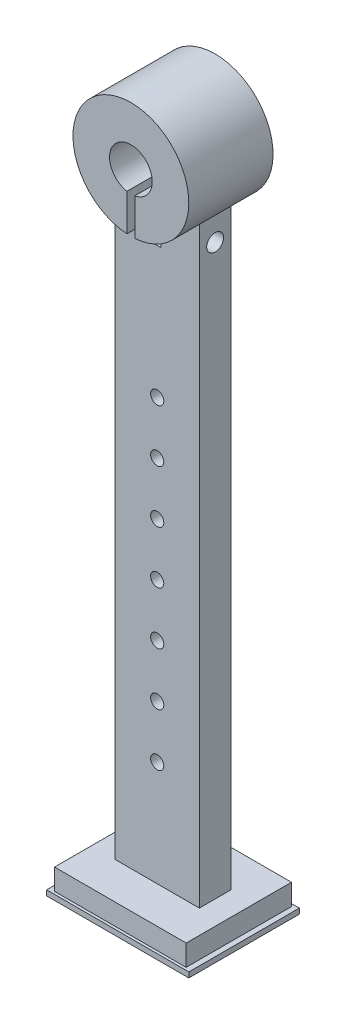
ISO-10303-21;
HEADER;
FILE_DESCRIPTION(('STEP AP214'),'2;1');
FILE_NAME('part.step','',(''),(''),'','','');
FILE_SCHEMA(('AUTOMOTIVE_DESIGN { 1 0 10303 214 1 1 1 1 }'));
ENDSEC;
DATA;
#1=APPLICATION_CONTEXT('core data for automotive mechanical design processes');
#2=APPLICATION_PROTOCOL_DEFINITION('international standard','automotive_design',2000,#1);
#3=PRODUCT_CONTEXT('',#1,'mechanical');
#4=PRODUCT('Part','Part','',(#3));
#5=PRODUCT_RELATED_PRODUCT_CATEGORY('part','',(#4));
#6=PRODUCT_DEFINITION_FORMATION('','',#4);
#7=PRODUCT_DEFINITION_CONTEXT('part definition',#1,'design');
#8=PRODUCT_DEFINITION('design','',#6,#7);
#9=PRODUCT_DEFINITION_SHAPE('','',#8);
#10=(LENGTH_UNIT() NAMED_UNIT(*) SI_UNIT(.MILLI.,.METRE.));
#11=(NAMED_UNIT(*) PLANE_ANGLE_UNIT() SI_UNIT($,.RADIAN.));
#12=(NAMED_UNIT(*) SI_UNIT($,.STERADIAN.) SOLID_ANGLE_UNIT());
#13=UNCERTAINTY_MEASURE_WITH_UNIT(LENGTH_MEASURE(1.E-05),#10,'distance_accuracy_value','');
#14=(GEOMETRIC_REPRESENTATION_CONTEXT(3) GLOBAL_UNCERTAINTY_ASSIGNED_CONTEXT((#13)) GLOBAL_UNIT_ASSIGNED_CONTEXT((#10,
#11,#12)) REPRESENTATION_CONTEXT('',''));
#15=CARTESIAN_POINT('',(0.,0.,0.));
#16=DIRECTION('',(0.,0.,1.));
#17=DIRECTION('',(1.,0.,0.));
#18=AXIS2_PLACEMENT_3D('',#15,#16,#17);
#19=CARTESIAN_POINT('',(0.,0.,8.));
#20=DIRECTION('',(0.,0.,-1.));
#21=DIRECTION('',(-1.,0.,0.));
#22=AXIS2_PLACEMENT_3D('',#19,#20,#21);
#23=CYLINDRICAL_SURFACE('',#22,4.05);
#24=DIRECTION('',(0.,0.,-1.));
#25=VECTOR('',#24,1.);
#26=CARTESIAN_POINT('',(0.75,-3.97994974842648,8.));
#27=LINE('',#26,#25);
#28=CARTESIAN_POINT('',(0.75,-3.97994974842648,8.));
#29=VERTEX_POINT('',#28);
#30=CARTESIAN_POINT('',(0.75,-3.97994974842648,-8.));
#31=VERTEX_POINT('',#30);
#32=EDGE_CURVE('E452',#29,#31,#27,.T.);
#33=ORIENTED_EDGE('',*,*,#32,.F.);
#34=CARTESIAN_POINT('',(0.,0.,8.));
#35=DIRECTION('',(0.,0.,1.));
#36=DIRECTION('',(1.,0.,0.));
#37=AXIS2_PLACEMENT_3D('',#34,#35,#36);
#38=CIRCLE('',#37,4.05);
#39=CARTESIAN_POINT('',(-0.75,-3.97994974842648,8.));
#40=VERTEX_POINT('',#39);
#41=EDGE_CURVE('E504',#29,#40,#38,.T.);
#42=ORIENTED_EDGE('',*,*,#41,.T.);
#43=DIRECTION('',(0.,0.,-1.));
#44=VECTOR('',#43,1.);
#45=CARTESIAN_POINT('',(-0.75,-3.97994974842648,8.));
#46=LINE('',#45,#44);
#47=CARTESIAN_POINT('',(-0.75,-3.97994974842648,-8.));
#48=VERTEX_POINT('',#47);
#49=EDGE_CURVE('E438',#48,#40,#46,.F.);
#50=ORIENTED_EDGE('',*,*,#49,.F.);
#51=CARTESIAN_POINT('',(0.,0.,-8.));
#52=DIRECTION('',(0.,0.,1.));
#53=DIRECTION('',(1.,0.,0.));
#54=AXIS2_PLACEMENT_3D('',#51,#52,#53);
#55=CIRCLE('',#54,4.05);
#56=EDGE_CURVE('E503',#31,#48,#55,.T.);
#57=ORIENTED_EDGE('',*,*,#56,.F.);
#58=EDGE_LOOP('',(#33,#42,#50,#57));
#59=FACE_BOUND('',#58,.T.);
#60=ADVANCED_FACE('F43',(#59),#23,.F.);
#61=CARTESIAN_POINT('',(0.,0.,8.));
#62=DIRECTION('',(0.,0.,-1.));
#63=DIRECTION('',(-1.,0.,0.));
#64=AXIS2_PLACEMENT_3D('',#61,#62,#63);
#65=CYLINDRICAL_SURFACE('',#64,11.);
#66=CARTESIAN_POINT('',(0.,0.,8.));
#67=DIRECTION('',(0.,0.,1.));
#68=DIRECTION('',(1.,0.,0.));
#69=AXIS2_PLACEMENT_3D('',#66,#67,#68);
#70=CIRCLE('',#69,11.);
#71=CARTESIAN_POINT('',(0.750000000000001,-10.974402033824,8.));
#72=VERTEX_POINT('',#71);
#73=CARTESIAN_POINT('',(-0.749999999999999,-10.974402033824,8.));
#74=VERTEX_POINT('',#73);
#75=EDGE_CURVE('E508',#72,#74,#70,.T.);
#76=ORIENTED_EDGE('',*,*,#75,.F.);
#77=DIRECTION('',(0.,0.,-1.));
#78=VECTOR('',#77,1.);
#79=CARTESIAN_POINT('',(0.750000000000001,-10.974402033824,8.));
#80=LINE('',#79,#78);
#81=CARTESIAN_POINT('',(0.750000000000001,-10.974402033824,3.));
#82=VERTEX_POINT('',#81);
#83=EDGE_CURVE('E449',#72,#82,#80,.T.);
#84=ORIENTED_EDGE('',*,*,#83,.T.);
#85=CARTESIAN_POINT('',(0.,0.,3.));
#86=DIRECTION('',(0.,0.,1.));
#87=DIRECTION('',(1.,0.,0.));
#88=AXIS2_PLACEMENT_3D('',#85,#86,#87);
#89=CIRCLE('',#88,11.);
#90=CARTESIAN_POINT('',(8.,-7.54983443527075,3.));
#91=VERTEX_POINT('',#90);
#92=EDGE_CURVE('E461',#82,#91,#89,.T.);
#93=ORIENTED_EDGE('',*,*,#92,.T.);
#94=DIRECTION('',(0.,0.,-1.));
#95=VECTOR('',#94,1.);
#96=CARTESIAN_POINT('',(8.,-7.54983443527075,3.));
#97=LINE('',#96,#95);
#98=CARTESIAN_POINT('',(8.,-7.54983443527075,-3.));
#99=VERTEX_POINT('',#98);
#100=EDGE_CURVE('E472',#91,#99,#97,.T.);
#101=ORIENTED_EDGE('',*,*,#100,.T.);
#102=CARTESIAN_POINT('',(0.,0.,-3.));
#103=DIRECTION('',(0.,0.,1.));
#104=DIRECTION('',(1.,0.,0.));
#105=AXIS2_PLACEMENT_3D('',#102,#103,#104);
#106=CIRCLE('',#105,11.);
#107=CARTESIAN_POINT('',(0.750000000000001,-10.974402033824,-3.));
#108=VERTEX_POINT('',#107);
#109=EDGE_CURVE('E455',#108,#99,#106,.T.);
#110=ORIENTED_EDGE('',*,*,#109,.F.);
#111=CARTESIAN_POINT('',(0.750000000000001,-10.974402033824,-8.));
#112=VERTEX_POINT('',#111);
#113=EDGE_CURVE('E444',#108,#112,#80,.T.);
#114=ORIENTED_EDGE('',*,*,#113,.T.);
#115=CARTESIAN_POINT('',(0.,0.,-8.));
#116=DIRECTION('',(0.,0.,1.));
#117=DIRECTION('',(1.,0.,0.));
#118=AXIS2_PLACEMENT_3D('',#115,#116,#117);
#119=CIRCLE('',#118,11.);
#120=CARTESIAN_POINT('',(-0.749999999999999,-10.974402033824,-8.));
#121=VERTEX_POINT('',#120);
#122=EDGE_CURVE('E509',#112,#121,#119,.T.);
#123=ORIENTED_EDGE('',*,*,#122,.T.);
#124=DIRECTION('',(0.,0.,-1.));
#125=VECTOR('',#124,1.);
#126=CARTESIAN_POINT('',(-0.749999999999999,-10.974402033824,8.));
#127=LINE('',#126,#125);
#128=CARTESIAN_POINT('',(-0.749999999999999,-10.974402033824,-3.));
#129=VERTEX_POINT('',#128);
#130=EDGE_CURVE('E428',#121,#129,#127,.F.);
#131=ORIENTED_EDGE('',*,*,#130,.T.);
#132=CARTESIAN_POINT('',(-8.,-7.54983443527075,-3.));
#133=VERTEX_POINT('',#132);
#134=EDGE_CURVE('E473',#133,#129,#106,.T.);
#135=ORIENTED_EDGE('',*,*,#134,.F.);
#136=DIRECTION('',(0.,0.,-1.));
#137=VECTOR('',#136,1.);
#138=CARTESIAN_POINT('',(-8.,-7.54983443527075,3.));
#139=LINE('',#138,#137);
#140=CARTESIAN_POINT('',(-8.,-7.54983443527075,3.));
#141=VERTEX_POINT('',#140);
#142=EDGE_CURVE('E499',#141,#133,#139,.T.);
#143=ORIENTED_EDGE('',*,*,#142,.F.);
#144=CARTESIAN_POINT('',(-0.749999999999999,-10.974402033824,3.));
#145=VERTEX_POINT('',#144);
#146=EDGE_CURVE('E456',#141,#145,#89,.T.);
#147=ORIENTED_EDGE('',*,*,#146,.T.);
#148=EDGE_CURVE('E435',#145,#74,#127,.F.);
#149=ORIENTED_EDGE('',*,*,#148,.T.);
#150=EDGE_LOOP('',(#76,#84,#93,#101,#110,#114,#123,#131,#135,#143,#147,#149));
#151=FACE_BOUND('',#150,.T.);
#152=ADVANCED_FACE('F547',(#151),#65,.T.);
#153=CARTESIAN_POINT('',(0.,0.,8.));
#154=DIRECTION('',(0.,0.,1.));
#155=DIRECTION('',(1.,0.,0.));
#156=AXIS2_PLACEMENT_3D('',#153,#154,#155);
#157=PLANE('',#156);
#158=DIRECTION('',(0.,1.,0.));
#159=VECTOR('',#158,1.);
#160=CARTESIAN_POINT('',(0.749999999999999,-3.,8.));
#161=LINE('',#160,#159);
#162=EDGE_CURVE('E410',#72,#29,#161,.T.);
#163=ORIENTED_EDGE('',*,*,#162,.F.);
#164=ORIENTED_EDGE('',*,*,#75,.T.);
#165=DIRECTION('',(0.,-1.,0.));
#166=VECTOR('',#165,1.);
#167=CARTESIAN_POINT('',(-0.750000000000001,-3.,8.));
#168=LINE('',#167,#166);
#169=EDGE_CURVE('E413',#40,#74,#168,.T.);
#170=ORIENTED_EDGE('',*,*,#169,.F.);
#171=ORIENTED_EDGE('',*,*,#41,.F.);
#172=EDGE_LOOP('',(#163,#164,#170,#171));
#173=FACE_BOUND('',#172,.T.);
#174=ADVANCED_FACE('F552',(#173),#157,.T.);
#175=CARTESIAN_POINT('',(0.,0.,-8.));
#176=DIRECTION('',(0.,0.,1.));
#177=DIRECTION('',(1.,0.,0.));
#178=AXIS2_PLACEMENT_3D('',#175,#176,#177);
#179=PLANE('',#178);
#180=ORIENTED_EDGE('',*,*,#122,.F.);
#181=DIRECTION('',(0.,1.,0.));
#182=VECTOR('',#181,1.);
#183=CARTESIAN_POINT('',(0.749999999999999,-3.,-8.));
#184=LINE('',#183,#182);
#185=EDGE_CURVE('E416',#112,#31,#184,.T.);
#186=ORIENTED_EDGE('',*,*,#185,.T.);
#187=ORIENTED_EDGE('',*,*,#56,.T.);
#188=DIRECTION('',(0.,-1.,0.));
#189=VECTOR('',#188,1.);
#190=CARTESIAN_POINT('',(-0.750000000000001,-3.,-8.));
#191=LINE('',#190,#189);
#192=EDGE_CURVE('E420',#48,#121,#191,.T.);
#193=ORIENTED_EDGE('',*,*,#192,.T.);
#194=EDGE_LOOP('',(#180,#186,#187,#193));
#195=FACE_BOUND('',#194,.T.);
#196=ADVANCED_FACE('F597',(#195),#179,.F.);
#197=CARTESIAN_POINT('',(-8.,0.,3.));
#198=DIRECTION('',(-1.,0.,0.));
#199=DIRECTION('',(0.,0.,1.));
#200=AXIS2_PLACEMENT_3D('',#197,#198,#199);
#201=PLANE('',#200);
#202=CARTESIAN_POINT('',(-8.,-12.,0.));
#203=DIRECTION('',(-1.,0.,0.));
#204=DIRECTION('',(0.,0.,1.));
#205=AXIS2_PLACEMENT_3D('',#202,#203,#204);
#206=CIRCLE('',#205,1.6);
#207=CARTESIAN_POINT('',(-8.,-12.,1.6));
#208=VERTEX_POINT('',#207);
#209=EDGE_CURVE('E406',#208,#208,#206,.T.);
#210=ORIENTED_EDGE('',*,*,#209,.F.);
#211=EDGE_LOOP('',(#210));
#212=FACE_BOUND('',#211,.T.);
#213=DIRECTION('',(0.,1.,0.));
#214=VECTOR('',#213,1.);
#215=CARTESIAN_POINT('',(-8.,0.,-3.));
#216=LINE('',#215,#214);
#217=CARTESIAN_POINT('',(-8.,-120.,-3.));
#218=VERTEX_POINT('',#217);
#219=EDGE_CURVE('E477',#218,#133,#216,.T.);
#220=ORIENTED_EDGE('',*,*,#219,.F.);
#221=DIRECTION('',(0.,0.,-1.));
#222=VECTOR('',#221,1.);
#223=CARTESIAN_POINT('',(-8.,-120.,3.));
#224=LINE('',#223,#222);
#225=CARTESIAN_POINT('',(-8.,-120.,3.));
#226=VERTEX_POINT('',#225);
#227=EDGE_CURVE('E495',#226,#218,#224,.T.);
#228=ORIENTED_EDGE('',*,*,#227,.F.);
#229=DIRECTION('',(0.,1.,0.));
#230=VECTOR('',#229,1.);
#231=CARTESIAN_POINT('',(-8.,0.,3.));
#232=LINE('',#231,#230);
#233=EDGE_CURVE('E460',#226,#141,#232,.T.);
#234=ORIENTED_EDGE('',*,*,#233,.T.);
#235=ORIENTED_EDGE('',*,*,#142,.T.);
#236=EDGE_LOOP('',(#220,#228,#234,#235));
#237=FACE_BOUND('',#236,.T.);
#238=ADVANCED_FACE('F591',(#212,#237),#201,.T.);
#239=CARTESIAN_POINT('',(8.,0.,3.));
#240=DIRECTION('',(-1.,0.,0.));
#241=DIRECTION('',(0.,0.,1.));
#242=AXIS2_PLACEMENT_3D('',#239,#240,#241);
#243=PLANE('',#242);
#244=CARTESIAN_POINT('',(8.,-12.,0.));
#245=DIRECTION('',(-1.,0.,0.));
#246=DIRECTION('',(0.,0.,1.));
#247=AXIS2_PLACEMENT_3D('',#244,#245,#246);
#248=CIRCLE('',#247,1.6);
#249=CARTESIAN_POINT('',(8.,-12.,1.6));
#250=VERTEX_POINT('',#249);
#251=EDGE_CURVE('E402',#250,#250,#248,.T.);
#252=ORIENTED_EDGE('',*,*,#251,.T.);
#253=EDGE_LOOP('',(#252));
#254=FACE_BOUND('',#253,.T.);
#255=DIRECTION('',(0.,1.,0.));
#256=VECTOR('',#255,1.);
#257=CARTESIAN_POINT('',(8.,0.,-3.));
#258=LINE('',#257,#256);
#259=CARTESIAN_POINT('',(8.,-120.,-3.));
#260=VERTEX_POINT('',#259);
#261=EDGE_CURVE('E485',#260,#99,#258,.T.);
#262=ORIENTED_EDGE('',*,*,#261,.T.);
#263=ORIENTED_EDGE('',*,*,#100,.F.);
#264=DIRECTION('',(0.,1.,0.));
#265=VECTOR('',#264,1.);
#266=CARTESIAN_POINT('',(8.,0.,3.));
#267=LINE('',#266,#265);
#268=CARTESIAN_POINT('',(8.,-120.,3.));
#269=VERTEX_POINT('',#268);
#270=EDGE_CURVE('E468',#269,#91,#267,.T.);
#271=ORIENTED_EDGE('',*,*,#270,.F.);
#272=DIRECTION('',(0.,0.,-1.));
#273=VECTOR('',#272,1.);
#274=CARTESIAN_POINT('',(8.,-120.,3.));
#275=LINE('',#274,#273);
#276=EDGE_CURVE('E492',#269,#260,#275,.T.);
#277=ORIENTED_EDGE('',*,*,#276,.T.);
#278=EDGE_LOOP('',(#262,#263,#271,#277));
#279=FACE_BOUND('',#278,.T.);
#280=ADVANCED_FACE('F582',(#254,#279),#243,.F.);
#281=CARTESIAN_POINT('',(0.,0.,3.));
#282=DIRECTION('',(0.,0.,1.));
#283=DIRECTION('',(1.,0.,0.));
#284=AXIS2_PLACEMENT_3D('',#281,#282,#283);
#285=PLANE('',#284);
#286=CARTESIAN_POINT('',(0.,-100.,3.));
#287=DIRECTION('',(0.,0.,1.));
#288=DIRECTION('',(1.,0.,0.));
#289=AXIS2_PLACEMENT_3D('',#286,#287,#288);
#290=CIRCLE('',#289,1.25);
#291=CARTESIAN_POINT('',(1.25000000000001,-100.,3.));
#292=VERTEX_POINT('',#291);
#293=EDGE_CURVE('E345',#292,#292,#290,.T.);
#294=ORIENTED_EDGE('',*,*,#293,.F.);
#295=EDGE_LOOP('',(#294));
#296=FACE_BOUND('',#295,.T.);
#297=CARTESIAN_POINT('',(0.,-90.,3.));
#298=DIRECTION('',(0.,0.,1.));
#299=DIRECTION('',(1.,0.,0.));
#300=AXIS2_PLACEMENT_3D('',#297,#298,#299);
#301=CIRCLE('',#300,1.25);
#302=CARTESIAN_POINT('',(1.25000000000001,-90.,3.));
#303=VERTEX_POINT('',#302);
#304=EDGE_CURVE('E353',#303,#303,#301,.T.);
#305=ORIENTED_EDGE('',*,*,#304,.F.);
#306=EDGE_LOOP('',(#305));
#307=FACE_BOUND('',#306,.T.);
#308=CARTESIAN_POINT('',(0.,-80.,3.));
#309=DIRECTION('',(0.,0.,1.));
#310=DIRECTION('',(1.,0.,0.));
#311=AXIS2_PLACEMENT_3D('',#308,#309,#310);
#312=CIRCLE('',#311,1.25);
#313=CARTESIAN_POINT('',(1.25000000000001,-80.,3.));
#314=VERTEX_POINT('',#313);
#315=EDGE_CURVE('E361',#314,#314,#312,.T.);
#316=ORIENTED_EDGE('',*,*,#315,.F.);
#317=EDGE_LOOP('',(#316));
#318=FACE_BOUND('',#317,.T.);
#319=CARTESIAN_POINT('',(0.,-70.,3.));
#320=DIRECTION('',(0.,0.,1.));
#321=DIRECTION('',(1.,0.,0.));
#322=AXIS2_PLACEMENT_3D('',#319,#320,#321);
#323=CIRCLE('',#322,1.25);
#324=CARTESIAN_POINT('',(1.25000000000001,-70.,3.));
#325=VERTEX_POINT('',#324);
#326=EDGE_CURVE('E369',#325,#325,#323,.T.);
#327=ORIENTED_EDGE('',*,*,#326,.F.);
#328=EDGE_LOOP('',(#327));
#329=FACE_BOUND('',#328,.T.);
#330=CARTESIAN_POINT('',(0.,-60.,3.));
#331=DIRECTION('',(0.,0.,1.));
#332=DIRECTION('',(1.,0.,0.));
#333=AXIS2_PLACEMENT_3D('',#330,#331,#332);
#334=CIRCLE('',#333,1.25);
#335=CARTESIAN_POINT('',(1.25000000000001,-60.,3.));
#336=VERTEX_POINT('',#335);
#337=EDGE_CURVE('E377',#336,#336,#334,.T.);
#338=ORIENTED_EDGE('',*,*,#337,.F.);
#339=EDGE_LOOP('',(#338));
#340=FACE_BOUND('',#339,.T.);
#341=CARTESIAN_POINT('',(0.,-50.,3.));
#342=DIRECTION('',(0.,0.,1.));
#343=DIRECTION('',(1.,0.,0.));
#344=AXIS2_PLACEMENT_3D('',#341,#342,#343);
#345=CIRCLE('',#344,1.25);
#346=CARTESIAN_POINT('',(1.25000000000001,-50.,3.));
#347=VERTEX_POINT('',#346);
#348=EDGE_CURVE('E385',#347,#347,#345,.T.);
#349=ORIENTED_EDGE('',*,*,#348,.F.);
#350=EDGE_LOOP('',(#349));
#351=FACE_BOUND('',#350,.T.);
#352=CARTESIAN_POINT('',(0.,-40.,3.));
#353=DIRECTION('',(0.,0.,1.));
#354=DIRECTION('',(1.,0.,0.));
#355=AXIS2_PLACEMENT_3D('',#352,#353,#354);
#356=CIRCLE('',#355,1.25);
#357=CARTESIAN_POINT('',(1.25000000000001,-40.,3.));
#358=VERTEX_POINT('',#357);
#359=EDGE_CURVE('E393',#358,#358,#356,.T.);
#360=ORIENTED_EDGE('',*,*,#359,.F.);
#361=EDGE_LOOP('',(#360));
#362=FACE_BOUND('',#361,.T.);
#363=DIRECTION('',(0.,1.,0.));
#364=VECTOR('',#363,1.);
#365=CARTESIAN_POINT('',(0.749999999999999,0.,3.));
#366=LINE('',#365,#364);
#367=CARTESIAN_POINT('',(0.750000000000001,-15.,3.));
#368=VERTEX_POINT('',#367);
#369=EDGE_CURVE('E448',#368,#82,#366,.T.);
#370=ORIENTED_EDGE('',*,*,#369,.F.);
#371=DIRECTION('',(1.,0.,0.));
#372=VECTOR('',#371,1.);
#373=CARTESIAN_POINT('',(0.,-15.,3.));
#374=LINE('',#373,#372);
#375=CARTESIAN_POINT('',(-0.749999999999999,-15.,3.));
#376=VERTEX_POINT('',#375);
#377=EDGE_CURVE('E441',#376,#368,#374,.T.);
#378=ORIENTED_EDGE('',*,*,#377,.F.);
#379=DIRECTION('',(0.,-1.,0.));
#380=VECTOR('',#379,1.);
#381=CARTESIAN_POINT('',(-0.750000000000001,0.,3.));
#382=LINE('',#381,#380);
#383=EDGE_CURVE('E434',#145,#376,#382,.T.);
#384=ORIENTED_EDGE('',*,*,#383,.F.);
#385=ORIENTED_EDGE('',*,*,#146,.F.);
#386=ORIENTED_EDGE('',*,*,#233,.F.);
#387=DIRECTION('',(1.,0.,0.));
#388=VECTOR('',#387,1.);
#389=CARTESIAN_POINT('',(0.,-120.,3.));
#390=LINE('',#389,#388);
#391=EDGE_CURVE('E465',#226,#269,#390,.T.);
#392=ORIENTED_EDGE('',*,*,#391,.T.);
#393=ORIENTED_EDGE('',*,*,#270,.T.);
#394=ORIENTED_EDGE('',*,*,#92,.F.);
#395=EDGE_LOOP('',(#370,#378,#384,#385,#386,#392,#393,#394));
#396=FACE_BOUND('',#395,.T.);
#397=ADVANCED_FACE('F577',(#296,#307,#318,#329,#340,#351,#362,#396),#285,.T.);
#398=CARTESIAN_POINT('',(0.,0.,-3.));
#399=DIRECTION('',(0.,0.,1.));
#400=DIRECTION('',(1.,0.,0.));
#401=AXIS2_PLACEMENT_3D('',#398,#399,#400);
#402=PLANE('',#401);
#403=CARTESIAN_POINT('',(0.,-100.,-3.));
#404=DIRECTION('',(0.,0.,1.));
#405=DIRECTION('',(1.,0.,0.));
#406=AXIS2_PLACEMENT_3D('',#403,#404,#405);
#407=CIRCLE('',#406,1.25);
#408=CARTESIAN_POINT('',(1.25000000000001,-100.,-3.));
#409=VERTEX_POINT('',#408);
#410=EDGE_CURVE('E349',#409,#409,#407,.T.);
#411=ORIENTED_EDGE('',*,*,#410,.T.);
#412=EDGE_LOOP('',(#411));
#413=FACE_BOUND('',#412,.T.);
#414=CARTESIAN_POINT('',(0.,-90.,-3.));
#415=DIRECTION('',(0.,0.,1.));
#416=DIRECTION('',(1.,0.,0.));
#417=AXIS2_PLACEMENT_3D('',#414,#415,#416);
#418=CIRCLE('',#417,1.25);
#419=CARTESIAN_POINT('',(1.25000000000001,-90.,-3.));
#420=VERTEX_POINT('',#419);
#421=EDGE_CURVE('E357',#420,#420,#418,.T.);
#422=ORIENTED_EDGE('',*,*,#421,.T.);
#423=EDGE_LOOP('',(#422));
#424=FACE_BOUND('',#423,.T.);
#425=CARTESIAN_POINT('',(0.,-80.,-3.));
#426=DIRECTION('',(0.,0.,1.));
#427=DIRECTION('',(1.,0.,0.));
#428=AXIS2_PLACEMENT_3D('',#425,#426,#427);
#429=CIRCLE('',#428,1.25);
#430=CARTESIAN_POINT('',(1.25000000000001,-80.,-3.));
#431=VERTEX_POINT('',#430);
#432=EDGE_CURVE('E365',#431,#431,#429,.T.);
#433=ORIENTED_EDGE('',*,*,#432,.T.);
#434=EDGE_LOOP('',(#433));
#435=FACE_BOUND('',#434,.T.);
#436=CARTESIAN_POINT('',(0.,-70.,-3.));
#437=DIRECTION('',(0.,0.,1.));
#438=DIRECTION('',(1.,0.,0.));
#439=AXIS2_PLACEMENT_3D('',#436,#437,#438);
#440=CIRCLE('',#439,1.25);
#441=CARTESIAN_POINT('',(1.25000000000001,-70.,-3.));
#442=VERTEX_POINT('',#441);
#443=EDGE_CURVE('E373',#442,#442,#440,.T.);
#444=ORIENTED_EDGE('',*,*,#443,.T.);
#445=EDGE_LOOP('',(#444));
#446=FACE_BOUND('',#445,.T.);
#447=CARTESIAN_POINT('',(0.,-60.,-3.));
#448=DIRECTION('',(0.,0.,1.));
#449=DIRECTION('',(1.,0.,0.));
#450=AXIS2_PLACEMENT_3D('',#447,#448,#449);
#451=CIRCLE('',#450,1.25);
#452=CARTESIAN_POINT('',(1.25000000000001,-60.,-3.));
#453=VERTEX_POINT('',#452);
#454=EDGE_CURVE('E381',#453,#453,#451,.T.);
#455=ORIENTED_EDGE('',*,*,#454,.T.);
#456=EDGE_LOOP('',(#455));
#457=FACE_BOUND('',#456,.T.);
#458=CARTESIAN_POINT('',(0.,-50.,-3.));
#459=DIRECTION('',(0.,0.,1.));
#460=DIRECTION('',(1.,0.,0.));
#461=AXIS2_PLACEMENT_3D('',#458,#459,#460);
#462=CIRCLE('',#461,1.25);
#463=CARTESIAN_POINT('',(1.25000000000001,-50.,-3.));
#464=VERTEX_POINT('',#463);
#465=EDGE_CURVE('E389',#464,#464,#462,.T.);
#466=ORIENTED_EDGE('',*,*,#465,.T.);
#467=EDGE_LOOP('',(#466));
#468=FACE_BOUND('',#467,.T.);
#469=CARTESIAN_POINT('',(0.,-40.,-3.));
#470=DIRECTION('',(0.,0.,1.));
#471=DIRECTION('',(1.,0.,0.));
#472=AXIS2_PLACEMENT_3D('',#469,#470,#471);
#473=CIRCLE('',#472,1.25);
#474=CARTESIAN_POINT('',(1.25000000000001,-40.,-3.));
#475=VERTEX_POINT('',#474);
#476=EDGE_CURVE('E46',#475,#475,#473,.T.);
#477=ORIENTED_EDGE('',*,*,#476,.T.);
#478=EDGE_LOOP('',(#477));
#479=FACE_BOUND('',#478,.T.);
#480=DIRECTION('',(1.,0.,0.));
#481=VECTOR('',#480,1.);
#482=CARTESIAN_POINT('',(0.,-15.,-3.));
#483=LINE('',#482,#481);
#484=CARTESIAN_POINT('',(-0.749999999999999,-15.,-3.));
#485=VERTEX_POINT('',#484);
#486=CARTESIAN_POINT('',(0.750000000000001,-15.,-3.));
#487=VERTEX_POINT('',#486);
#488=EDGE_CURVE('E52',#485,#487,#483,.T.);
#489=ORIENTED_EDGE('',*,*,#488,.T.);
#490=DIRECTION('',(0.,1.,0.));
#491=VECTOR('',#490,1.);
#492=CARTESIAN_POINT('',(0.749999999999999,0.,-3.));
#493=LINE('',#492,#491);
#494=EDGE_CURVE('E11',#487,#108,#493,.T.);
#495=ORIENTED_EDGE('',*,*,#494,.T.);
#496=ORIENTED_EDGE('',*,*,#109,.T.);
#497=ORIENTED_EDGE('',*,*,#261,.F.);
#498=DIRECTION('',(1.,0.,0.));
#499=VECTOR('',#498,1.);
#500=CARTESIAN_POINT('',(0.,-120.,-3.));
#501=LINE('',#500,#499);
#502=EDGE_CURVE('E481',#218,#260,#501,.T.);
#503=ORIENTED_EDGE('',*,*,#502,.F.);
#504=ORIENTED_EDGE('',*,*,#219,.T.);
#505=ORIENTED_EDGE('',*,*,#134,.T.);
#506=DIRECTION('',(0.,-1.,0.));
#507=VECTOR('',#506,1.);
#508=CARTESIAN_POINT('',(-0.750000000000001,0.,-3.));
#509=LINE('',#508,#507);
#510=EDGE_CURVE('E513',#129,#485,#509,.T.);
#511=ORIENTED_EDGE('',*,*,#510,.T.);
#512=EDGE_LOOP('',(#489,#495,#496,#497,#503,#504,#505,#511));
#513=FACE_BOUND('',#512,.T.);
#514=ADVANCED_FACE('F586',(#413,#424,#435,#446,#457,#468,#479,#513),#402,.F.);
#515=CARTESIAN_POINT('',(0.749999999999999,-3.,-8.));
#516=DIRECTION('',(1.,0.,0.));
#517=DIRECTION('',(0.,1.,0.));
#518=AXIS2_PLACEMENT_3D('',#515,#516,#517);
#519=PLANE('',#518);
#520=CARTESIAN_POINT('',(0.750000000000001,-12.,0.));
#521=DIRECTION('',(1.,0.,0.));
#522=DIRECTION('',(0.,1.,0.));
#523=AXIS2_PLACEMENT_3D('',#520,#521,#522);
#524=CIRCLE('',#523,1.6);
#525=CARTESIAN_POINT('',(0.75,-10.4,0.));
#526=VERTEX_POINT('',#525);
#527=EDGE_CURVE('E398',#526,#526,#524,.T.);
#528=ORIENTED_EDGE('',*,*,#527,.T.);
#529=EDGE_LOOP('',(#528));
#530=FACE_BOUND('',#529,.T.);
#531=ORIENTED_EDGE('',*,*,#32,.T.);
#532=ORIENTED_EDGE('',*,*,#185,.F.);
#533=ORIENTED_EDGE('',*,*,#113,.F.);
#534=ORIENTED_EDGE('',*,*,#494,.F.);
#535=DIRECTION('',(0.,0.,1.));
#536=VECTOR('',#535,1.);
#537=CARTESIAN_POINT('',(0.750000000000001,-15.,-8.));
#538=LINE('',#537,#536);
#539=EDGE_CURVE('E424',#487,#368,#538,.T.);
#540=ORIENTED_EDGE('',*,*,#539,.T.);
#541=ORIENTED_EDGE('',*,*,#369,.T.);
#542=ORIENTED_EDGE('',*,*,#83,.F.);
#543=ORIENTED_EDGE('',*,*,#162,.T.);
#544=EDGE_LOOP('',(#531,#532,#533,#534,#540,#541,#542,#543));
#545=FACE_BOUND('',#544,.T.);
#546=ADVANCED_FACE('F598',(#530,#545),#519,.F.);
#547=CARTESIAN_POINT('',(-0.749999999999999,-15.,-8.));
#548=DIRECTION('',(0.,-1.,0.));
#549=DIRECTION('',(0.,0.,-1.));
#550=AXIS2_PLACEMENT_3D('',#547,#548,#549);
#551=PLANE('',#550);
#552=ORIENTED_EDGE('',*,*,#377,.T.);
#553=ORIENTED_EDGE('',*,*,#539,.F.);
#554=ORIENTED_EDGE('',*,*,#488,.F.);
#555=DIRECTION('',(0.,0.,1.));
#556=VECTOR('',#555,1.);
#557=CARTESIAN_POINT('',(-0.749999999999999,-15.,-8.));
#558=LINE('',#557,#556);
#559=EDGE_CURVE('E68',#485,#376,#558,.T.);
#560=ORIENTED_EDGE('',*,*,#559,.T.);
#561=EDGE_LOOP('',(#552,#553,#554,#560));
#562=FACE_BOUND('',#561,.T.);
#563=ADVANCED_FACE('F542',(#562),#551,.F.);
#564=CARTESIAN_POINT('',(-0.750000000000001,-3.,-8.));
#565=DIRECTION('',(-1.,0.,0.));
#566=DIRECTION('',(0.,-1.,0.));
#567=AXIS2_PLACEMENT_3D('',#564,#565,#566);
#568=PLANE('',#567);
#569=CARTESIAN_POINT('',(-0.749999999999999,-12.,0.));
#570=DIRECTION('',(-1.,0.,0.));
#571=DIRECTION('',(0.,-1.,0.));
#572=AXIS2_PLACEMENT_3D('',#569,#570,#571);
#573=CIRCLE('',#572,1.6);
#574=CARTESIAN_POINT('',(-0.749999999999999,-13.6,0.));
#575=VERTEX_POINT('',#574);
#576=EDGE_CURVE('E397',#575,#575,#573,.T.);
#577=ORIENTED_EDGE('',*,*,#576,.T.);
#578=EDGE_LOOP('',(#577));
#579=FACE_BOUND('',#578,.T.);
#580=ORIENTED_EDGE('',*,*,#49,.T.);
#581=ORIENTED_EDGE('',*,*,#169,.T.);
#582=ORIENTED_EDGE('',*,*,#148,.F.);
#583=ORIENTED_EDGE('',*,*,#383,.T.);
#584=ORIENTED_EDGE('',*,*,#559,.F.);
#585=ORIENTED_EDGE('',*,*,#510,.F.);
#586=ORIENTED_EDGE('',*,*,#130,.F.);
#587=ORIENTED_EDGE('',*,*,#192,.F.);
#588=EDGE_LOOP('',(#580,#581,#582,#583,#584,#585,#586,#587));
#589=FACE_BOUND('',#588,.T.);
#590=ADVANCED_FACE('F529',(#579,#589),#568,.F.);
#591=CARTESIAN_POINT('',(-11.,-12.,0.));
#592=DIRECTION('',(1.,0.,0.));
#593=DIRECTION('',(0.,0.,-1.));
#594=AXIS2_PLACEMENT_3D('',#591,#592,#593);
#595=CYLINDRICAL_SURFACE('',#594,1.6);
#596=ORIENTED_EDGE('',*,*,#209,.T.);
#597=EDGE_LOOP('',(#596));
#598=FACE_BOUND('',#597,.T.);
#599=ORIENTED_EDGE('',*,*,#576,.F.);
#600=EDGE_LOOP('',(#599));
#601=FACE_BOUND('',#600,.T.);
#602=ADVANCED_FACE('F531',(#598,#601),#595,.F.);
#603=ORIENTED_EDGE('',*,*,#527,.F.);
#604=EDGE_LOOP('',(#603));
#605=FACE_BOUND('',#604,.T.);
#606=ORIENTED_EDGE('',*,*,#251,.F.);
#607=EDGE_LOOP('',(#606));
#608=FACE_BOUND('',#607,.T.);
#609=ADVANCED_FACE('F533',(#605,#608),#595,.F.);
#610=CARTESIAN_POINT('',(0.,-40.,-8.));
#611=DIRECTION('',(0.,0.,1.));
#612=DIRECTION('',(1.,0.,0.));
#613=AXIS2_PLACEMENT_3D('',#610,#611,#612);
#614=CYLINDRICAL_SURFACE('',#613,1.25);
#615=ORIENTED_EDGE('',*,*,#359,.T.);
#616=EDGE_LOOP('',(#615));
#617=FACE_BOUND('',#616,.T.);
#618=ORIENTED_EDGE('',*,*,#476,.F.);
#619=EDGE_LOOP('',(#618));
#620=FACE_BOUND('',#619,.T.);
#621=ADVANCED_FACE('F540',(#617,#620),#614,.F.);
#622=CARTESIAN_POINT('',(0.,-50.,-8.));
#623=DIRECTION('',(0.,0.,1.));
#624=DIRECTION('',(1.,0.,0.));
#625=AXIS2_PLACEMENT_3D('',#622,#623,#624);
#626=CYLINDRICAL_SURFACE('',#625,1.25);
#627=ORIENTED_EDGE('',*,*,#348,.T.);
#628=EDGE_LOOP('',(#627));
#629=FACE_BOUND('',#628,.T.);
#630=ORIENTED_EDGE('',*,*,#465,.F.);
#631=EDGE_LOOP('',(#630));
#632=FACE_BOUND('',#631,.T.);
#633=ADVANCED_FACE('F878',(#629,#632),#626,.F.);
#634=CARTESIAN_POINT('',(0.,-60.,-8.));
#635=DIRECTION('',(0.,0.,1.));
#636=DIRECTION('',(1.,0.,0.));
#637=AXIS2_PLACEMENT_3D('',#634,#635,#636);
#638=CYLINDRICAL_SURFACE('',#637,1.25);
#639=ORIENTED_EDGE('',*,*,#337,.T.);
#640=EDGE_LOOP('',(#639));
#641=FACE_BOUND('',#640,.T.);
#642=ORIENTED_EDGE('',*,*,#454,.F.);
#643=EDGE_LOOP('',(#642));
#644=FACE_BOUND('',#643,.T.);
#645=ADVANCED_FACE('F868',(#641,#644),#638,.F.);
#646=CARTESIAN_POINT('',(0.,-70.,-8.));
#647=DIRECTION('',(0.,0.,1.));
#648=DIRECTION('',(1.,0.,0.));
#649=AXIS2_PLACEMENT_3D('',#646,#647,#648);
#650=CYLINDRICAL_SURFACE('',#649,1.25);
#651=ORIENTED_EDGE('',*,*,#326,.T.);
#652=EDGE_LOOP('',(#651));
#653=FACE_BOUND('',#652,.T.);
#654=ORIENTED_EDGE('',*,*,#443,.F.);
#655=EDGE_LOOP('',(#654));
#656=FACE_BOUND('',#655,.T.);
#657=ADVANCED_FACE('F858',(#653,#656),#650,.F.);
#658=CARTESIAN_POINT('',(0.,-80.,-8.));
#659=DIRECTION('',(0.,0.,1.));
#660=DIRECTION('',(1.,0.,0.));
#661=AXIS2_PLACEMENT_3D('',#658,#659,#660);
#662=CYLINDRICAL_SURFACE('',#661,1.25);
#663=ORIENTED_EDGE('',*,*,#315,.T.);
#664=EDGE_LOOP('',(#663));
#665=FACE_BOUND('',#664,.T.);
#666=ORIENTED_EDGE('',*,*,#432,.F.);
#667=EDGE_LOOP('',(#666));
#668=FACE_BOUND('',#667,.T.);
#669=ADVANCED_FACE('F848',(#665,#668),#662,.F.);
#670=CARTESIAN_POINT('',(0.,-90.,-8.));
#671=DIRECTION('',(0.,0.,1.));
#672=DIRECTION('',(1.,0.,0.));
#673=AXIS2_PLACEMENT_3D('',#670,#671,#672);
#674=CYLINDRICAL_SURFACE('',#673,1.25);
#675=ORIENTED_EDGE('',*,*,#304,.T.);
#676=EDGE_LOOP('',(#675));
#677=FACE_BOUND('',#676,.T.);
#678=ORIENTED_EDGE('',*,*,#421,.F.);
#679=EDGE_LOOP('',(#678));
#680=FACE_BOUND('',#679,.T.);
#681=ADVANCED_FACE('F839',(#677,#680),#674,.F.);
#682=CARTESIAN_POINT('',(0.,-100.,-8.));
#683=DIRECTION('',(0.,0.,1.));
#684=DIRECTION('',(1.,0.,0.));
#685=AXIS2_PLACEMENT_3D('',#682,#683,#684);
#686=CYLINDRICAL_SURFACE('',#685,1.25);
#687=ORIENTED_EDGE('',*,*,#293,.T.);
#688=EDGE_LOOP('',(#687));
#689=FACE_BOUND('',#688,.T.);
#690=ORIENTED_EDGE('',*,*,#410,.F.);
#691=EDGE_LOOP('',(#690));
#692=FACE_BOUND('',#691,.T.);
#693=ADVANCED_FACE('F671',(#689,#692),#686,.F.);
#694=CARTESIAN_POINT('',(12.5,-124.,-10.));
#695=DIRECTION('',(-1.,0.,0.));
#696=DIRECTION('',(0.,0.,1.));
#697=AXIS2_PLACEMENT_3D('',#694,#695,#696);
#698=PLANE('',#697);
#699=DIRECTION('',(0.,0.,1.));
#700=VECTOR('',#699,1.);
#701=CARTESIAN_POINT('',(12.5,-120.,-10.));
#702=LINE('',#701,#700);
#703=CARTESIAN_POINT('',(12.5,-120.,-10.));
#704=VERTEX_POINT('',#703);
#705=CARTESIAN_POINT('',(12.5,-120.,10.));
#706=VERTEX_POINT('',#705);
#707=EDGE_CURVE('E300',#704,#706,#702,.T.);
#708=ORIENTED_EDGE('',*,*,#707,.T.);
#709=DIRECTION('',(0.,1.,0.));
#710=VECTOR('',#709,1.);
#711=CARTESIAN_POINT('',(12.5,-124.,10.));
#712=LINE('',#711,#710);
#713=CARTESIAN_POINT('',(12.5,-124.,10.));
#714=VERTEX_POINT('',#713);
#715=EDGE_CURVE('E341',#714,#706,#712,.T.);
#716=ORIENTED_EDGE('',*,*,#715,.F.);
#717=DIRECTION('',(0.,0.,1.));
#718=VECTOR('',#717,1.);
#719=CARTESIAN_POINT('',(12.5,-124.,-10.));
#720=LINE('',#719,#718);
#721=CARTESIAN_POINT('',(12.5,-124.,-10.));
#722=VERTEX_POINT('',#721);
#723=EDGE_CURVE('E301',#722,#714,#720,.T.);
#724=ORIENTED_EDGE('',*,*,#723,.F.);
#725=DIRECTION('',(0.,1.,0.));
#726=VECTOR('',#725,1.);
#727=CARTESIAN_POINT('',(12.5,-124.,-10.));
#728=LINE('',#727,#726);
#729=EDGE_CURVE('E318',#722,#704,#728,.T.);
#730=ORIENTED_EDGE('',*,*,#729,.T.);
#731=EDGE_LOOP('',(#708,#716,#724,#730));
#732=FACE_BOUND('',#731,.T.);
#733=ADVANCED_FACE('F665',(#732),#698,.F.);
#734=CARTESIAN_POINT('',(-12.5,-124.,10.));
#735=DIRECTION('',(0.,0.,-1.));
#736=DIRECTION('',(-1.,0.,0.));
#737=AXIS2_PLACEMENT_3D('',#734,#735,#736);
#738=PLANE('',#737);
#739=DIRECTION('',(-1.,0.,0.));
#740=VECTOR('',#739,1.);
#741=CARTESIAN_POINT('',(-12.5,-120.,10.));
#742=LINE('',#741,#740);
#743=CARTESIAN_POINT('',(-12.5,-120.,10.));
#744=VERTEX_POINT('',#743);
#745=EDGE_CURVE('E322',#706,#744,#742,.T.);
#746=ORIENTED_EDGE('',*,*,#745,.T.);
#747=DIRECTION('',(0.,1.,0.));
#748=VECTOR('',#747,1.);
#749=CARTESIAN_POINT('',(-12.5,-124.,10.));
#750=LINE('',#749,#748);
#751=CARTESIAN_POINT('',(-12.5,-124.,10.));
#752=VERTEX_POINT('',#751);
#753=EDGE_CURVE('E337',#752,#744,#750,.T.);
#754=ORIENTED_EDGE('',*,*,#753,.F.);
#755=DIRECTION('',(-1.,0.,0.));
#756=VECTOR('',#755,1.);
#757=CARTESIAN_POINT('',(-12.5,-124.,10.));
#758=LINE('',#757,#756);
#759=EDGE_CURVE('E305',#714,#752,#758,.T.);
#760=ORIENTED_EDGE('',*,*,#759,.F.);
#761=ORIENTED_EDGE('',*,*,#715,.T.);
#762=EDGE_LOOP('',(#746,#754,#760,#761));
#763=FACE_BOUND('',#762,.T.);
#764=ADVANCED_FACE('F670',(#763),#738,.F.);
#765=CARTESIAN_POINT('',(-12.5,-124.,-10.));
#766=DIRECTION('',(1.,0.,0.));
#767=DIRECTION('',(0.,0.,-1.));
#768=AXIS2_PLACEMENT_3D('',#765,#766,#767);
#769=PLANE('',#768);
#770=DIRECTION('',(0.,0.,-1.));
#771=VECTOR('',#770,1.);
#772=CARTESIAN_POINT('',(-12.5,-120.,-10.));
#773=LINE('',#772,#771);
#774=CARTESIAN_POINT('',(-12.5,-120.,-10.));
#775=VERTEX_POINT('',#774);
#776=EDGE_CURVE('E325',#744,#775,#773,.T.);
#777=ORIENTED_EDGE('',*,*,#776,.T.);
#778=DIRECTION('',(0.,1.,0.));
#779=VECTOR('',#778,1.);
#780=CARTESIAN_POINT('',(-12.5,-124.,-10.));
#781=LINE('',#780,#779);
#782=CARTESIAN_POINT('',(-12.5,-124.,-10.));
#783=VERTEX_POINT('',#782);
#784=EDGE_CURVE('E333',#783,#775,#781,.T.);
#785=ORIENTED_EDGE('',*,*,#784,.F.);
#786=DIRECTION('',(0.,0.,-1.));
#787=VECTOR('',#786,1.);
#788=CARTESIAN_POINT('',(-12.5,-124.,-10.));
#789=LINE('',#788,#787);
#790=EDGE_CURVE('E310',#752,#783,#789,.T.);
#791=ORIENTED_EDGE('',*,*,#790,.F.);
#792=ORIENTED_EDGE('',*,*,#753,.T.);
#793=EDGE_LOOP('',(#777,#785,#791,#792));
#794=FACE_BOUND('',#793,.T.);
#795=ADVANCED_FACE('F684',(#794),#769,.F.);
#796=CARTESIAN_POINT('',(-12.5,-124.,-10.));
#797=DIRECTION('',(0.,0.,1.));
#798=DIRECTION('',(1.,0.,0.));
#799=AXIS2_PLACEMENT_3D('',#796,#797,#798);
#800=PLANE('',#799);
#801=DIRECTION('',(1.,0.,0.));
#802=VECTOR('',#801,1.);
#803=CARTESIAN_POINT('',(-12.5,-120.,-10.));
#804=LINE('',#803,#802);
#805=EDGE_CURVE('E306',#775,#704,#804,.T.);
#806=ORIENTED_EDGE('',*,*,#805,.T.);
#807=ORIENTED_EDGE('',*,*,#729,.F.);
#808=DIRECTION('',(1.,0.,0.));
#809=VECTOR('',#808,1.);
#810=CARTESIAN_POINT('',(-12.5,-124.,-10.));
#811=LINE('',#810,#809);
#812=EDGE_CURVE('E314',#783,#722,#811,.T.);
#813=ORIENTED_EDGE('',*,*,#812,.F.);
#814=ORIENTED_EDGE('',*,*,#784,.T.);
#815=EDGE_LOOP('',(#806,#807,#813,#814));
#816=FACE_BOUND('',#815,.T.);
#817=ADVANCED_FACE('F655',(#816),#800,.F.);
#818=CARTESIAN_POINT('',(0.,-120.,0.));
#819=DIRECTION('',(0.,1.,0.));
#820=DIRECTION('',(0.,0.,1.));
#821=AXIS2_PLACEMENT_3D('',#818,#819,#820);
#822=PLANE('',#821);
#823=ORIENTED_EDGE('',*,*,#227,.T.);
#824=ORIENTED_EDGE('',*,*,#502,.T.);
#825=ORIENTED_EDGE('',*,*,#276,.F.);
#826=ORIENTED_EDGE('',*,*,#391,.F.);
#827=EDGE_LOOP('',(#823,#824,#825,#826));
#828=FACE_BOUND('',#827,.T.);
#829=ORIENTED_EDGE('',*,*,#707,.F.);
#830=ORIENTED_EDGE('',*,*,#805,.F.);
#831=ORIENTED_EDGE('',*,*,#776,.F.);
#832=ORIENTED_EDGE('',*,*,#745,.F.);
#833=EDGE_LOOP('',(#829,#830,#831,#832));
#834=FACE_BOUND('',#833,.T.);
#835=ADVANCED_FACE('F588',(#828,#834),#822,.T.);
#836=CARTESIAN_POINT('',(0.,-124.,0.));
#837=DIRECTION('',(0.,-1.,0.));
#838=DIRECTION('',(0.,0.,-1.));
#839=AXIS2_PLACEMENT_3D('',#836,#837,#838);
#840=PLANE('',#839);
#841=DIRECTION('',(1.,0.,0.));
#842=VECTOR('',#841,1.);
#843=CARTESIAN_POINT('',(-13.5,-124.,-10.5));
#844=LINE('',#843,#842);
#845=CARTESIAN_POINT('',(-13.5,-124.,-10.5));
#846=VERTEX_POINT('',#845);
#847=CARTESIAN_POINT('',(13.5,-124.,-10.5));
#848=VERTEX_POINT('',#847);
#849=EDGE_CURVE('E225',#846,#848,#844,.T.);
#850=ORIENTED_EDGE('',*,*,#849,.F.);
#851=DIRECTION('',(0.,0.,-1.));
#852=VECTOR('',#851,1.);
#853=CARTESIAN_POINT('',(-13.5,-124.,-10.5));
#854=LINE('',#853,#852);
#855=CARTESIAN_POINT('',(-13.5,-124.,10.5));
#856=VERTEX_POINT('',#855);
#857=EDGE_CURVE('E264',#856,#846,#854,.T.);
#858=ORIENTED_EDGE('',*,*,#857,.F.);
#859=DIRECTION('',(-1.,0.,0.));
#860=VECTOR('',#859,1.);
#861=CARTESIAN_POINT('',(-13.5,-124.,10.5));
#862=LINE('',#861,#860);
#863=CARTESIAN_POINT('',(13.5,-124.,10.5));
#864=VERTEX_POINT('',#863);
#865=EDGE_CURVE('E280',#864,#856,#862,.T.);
#866=ORIENTED_EDGE('',*,*,#865,.F.);
#867=DIRECTION('',(0.,0.,1.));
#868=VECTOR('',#867,1.);
#869=CARTESIAN_POINT('',(13.5,-124.,-10.5));
#870=LINE('',#869,#868);
#871=EDGE_CURVE('E277',#848,#864,#870,.T.);
#872=ORIENTED_EDGE('',*,*,#871,.F.);
#873=EDGE_LOOP('',(#850,#858,#866,#872));
#874=FACE_BOUND('',#873,.T.);
#875=ORIENTED_EDGE('',*,*,#812,.T.);
#876=ORIENTED_EDGE('',*,*,#723,.T.);
#877=ORIENTED_EDGE('',*,*,#759,.T.);
#878=ORIENTED_EDGE('',*,*,#790,.T.);
#879=EDGE_LOOP('',(#875,#876,#877,#878));
#880=FACE_BOUND('',#879,.T.);
#881=ADVANCED_FACE('F654',(#874,#880),#840,.F.);
#882=CARTESIAN_POINT('',(0.,-125.,0.));
#883=DIRECTION('',(0.,-1.,0.));
#884=DIRECTION('',(0.,0.,-1.));
#885=AXIS2_PLACEMENT_3D('',#882,#883,#884);
#886=PLANE('',#885);
#887=DIRECTION('',(1.,0.,0.));
#888=VECTOR('',#887,1.);
#889=CARTESIAN_POINT('',(-13.5,-125.,-10.5));
#890=LINE('',#889,#888);
#891=CARTESIAN_POINT('',(-13.5,-125.,-10.5));
#892=VERTEX_POINT('',#891);
#893=CARTESIAN_POINT('',(13.5,-125.,-10.5));
#894=VERTEX_POINT('',#893);
#895=EDGE_CURVE('E259',#892,#894,#890,.T.);
#896=ORIENTED_EDGE('',*,*,#895,.T.);
#897=DIRECTION('',(0.,0.,1.));
#898=VECTOR('',#897,1.);
#899=CARTESIAN_POINT('',(13.5,-125.,-10.5));
#900=LINE('',#899,#898);
#901=CARTESIAN_POINT('',(13.5,-125.,10.5));
#902=VERTEX_POINT('',#901);
#903=EDGE_CURVE('E263',#894,#902,#900,.T.);
#904=ORIENTED_EDGE('',*,*,#903,.T.);
#905=DIRECTION('',(-1.,0.,0.));
#906=VECTOR('',#905,1.);
#907=CARTESIAN_POINT('',(-13.5,-125.,10.5));
#908=LINE('',#907,#906);
#909=CARTESIAN_POINT('',(-13.5,-125.,10.5));
#910=VERTEX_POINT('',#909);
#911=EDGE_CURVE('E267',#902,#910,#908,.T.);
#912=ORIENTED_EDGE('',*,*,#911,.T.);
#913=DIRECTION('',(0.,0.,-1.));
#914=VECTOR('',#913,1.);
#915=CARTESIAN_POINT('',(-13.5,-125.,-10.5));
#916=LINE('',#915,#914);
#917=EDGE_CURVE('E270',#910,#892,#916,.T.);
#918=ORIENTED_EDGE('',*,*,#917,.T.);
#919=EDGE_LOOP('',(#896,#904,#912,#918));
#920=FACE_BOUND('',#919,.T.);
#921=DIRECTION('',(-1.,0.,0.));
#922=VECTOR('',#921,1.);
#923=CARTESIAN_POINT('',(-11.5,-125.,8.5));
#924=LINE('',#923,#922);
#925=CARTESIAN_POINT('',(11.5,-125.,8.5));
#926=VERTEX_POINT('',#925);
#927=CARTESIAN_POINT('',(-11.5,-125.,8.5));
#928=VERTEX_POINT('',#927);
#929=EDGE_CURVE('E216',#926,#928,#924,.T.);
#930=ORIENTED_EDGE('',*,*,#929,.F.);
#931=DIRECTION('',(0.,0.,1.));
#932=VECTOR('',#931,1.);
#933=CARTESIAN_POINT('',(11.5,-125.,-8.5));
#934=LINE('',#933,#932);
#935=CARTESIAN_POINT('',(11.5,-125.,-8.5));
#936=VERTEX_POINT('',#935);
#937=EDGE_CURVE('E207',#936,#926,#934,.T.);
#938=ORIENTED_EDGE('',*,*,#937,.F.);
#939=DIRECTION('',(1.,0.,0.));
#940=VECTOR('',#939,1.);
#941=CARTESIAN_POINT('',(-11.5,-125.,-8.5));
#942=LINE('',#941,#940);
#943=CARTESIAN_POINT('',(-11.5,-125.,-8.5));
#944=VERTEX_POINT('',#943);
#945=EDGE_CURVE('E235',#944,#936,#942,.T.);
#946=ORIENTED_EDGE('',*,*,#945,.F.);
#947=DIRECTION('',(0.,0.,-1.));
#948=VECTOR('',#947,1.);
#949=CARTESIAN_POINT('',(-11.5,-125.,-8.5));
#950=LINE('',#949,#948);
#951=EDGE_CURVE('E231',#928,#944,#950,.T.);
#952=ORIENTED_EDGE('',*,*,#951,.F.);
#953=EDGE_LOOP('',(#930,#938,#946,#952));
#954=FACE_BOUND('',#953,.T.);
#955=ADVANCED_FACE('F229',(#920,#954),#886,.T.);
#956=CARTESIAN_POINT('',(-13.5,-125.,-10.5));
#957=DIRECTION('',(0.,0.,1.));
#958=DIRECTION('',(1.,0.,0.));
#959=AXIS2_PLACEMENT_3D('',#956,#957,#958);
#960=PLANE('',#959);
#961=ORIENTED_EDGE('',*,*,#849,.T.);
#962=DIRECTION('',(0.,1.,0.));
#963=VECTOR('',#962,1.);
#964=CARTESIAN_POINT('',(13.5,-125.,-10.5));
#965=LINE('',#964,#963);
#966=EDGE_CURVE('E296',#894,#848,#965,.T.);
#967=ORIENTED_EDGE('',*,*,#966,.F.);
#968=ORIENTED_EDGE('',*,*,#895,.F.);
#969=DIRECTION('',(0.,1.,0.));
#970=VECTOR('',#969,1.);
#971=CARTESIAN_POINT('',(-13.5,-125.,-10.5));
#972=LINE('',#971,#970);
#973=EDGE_CURVE('E273',#892,#846,#972,.T.);
#974=ORIENTED_EDGE('',*,*,#973,.T.);
#975=EDGE_LOOP('',(#961,#967,#968,#974));
#976=FACE_BOUND('',#975,.T.);
#977=ADVANCED_FACE('F722',(#976),#960,.F.);
#978=CARTESIAN_POINT('',(13.5,-125.,-10.5));
#979=DIRECTION('',(-1.,0.,0.));
#980=DIRECTION('',(0.,0.,1.));
#981=AXIS2_PLACEMENT_3D('',#978,#979,#980);
#982=PLANE('',#981);
#983=ORIENTED_EDGE('',*,*,#871,.T.);
#984=DIRECTION('',(0.,1.,0.));
#985=VECTOR('',#984,1.);
#986=CARTESIAN_POINT('',(13.5,-125.,10.5));
#987=LINE('',#986,#985);
#988=EDGE_CURVE('E292',#902,#864,#987,.T.);
#989=ORIENTED_EDGE('',*,*,#988,.F.);
#990=ORIENTED_EDGE('',*,*,#903,.F.);
#991=ORIENTED_EDGE('',*,*,#966,.T.);
#992=EDGE_LOOP('',(#983,#989,#990,#991));
#993=FACE_BOUND('',#992,.T.);
#994=ADVANCED_FACE('F733',(#993),#982,.F.);
#995=CARTESIAN_POINT('',(-13.5,-125.,10.5));
#996=DIRECTION('',(0.,0.,-1.));
#997=DIRECTION('',(-1.,0.,0.));
#998=AXIS2_PLACEMENT_3D('',#995,#996,#997);
#999=PLANE('',#998);
#1000=ORIENTED_EDGE('',*,*,#865,.T.);
#1001=DIRECTION('',(0.,1.,0.));
#1002=VECTOR('',#1001,1.);
#1003=CARTESIAN_POINT('',(-13.5,-125.,10.5));
#1004=LINE('',#1003,#1002);
#1005=EDGE_CURVE('E288',#910,#856,#1004,.T.);
#1006=ORIENTED_EDGE('',*,*,#1005,.F.);
#1007=ORIENTED_EDGE('',*,*,#911,.F.);
#1008=ORIENTED_EDGE('',*,*,#988,.T.);
#1009=EDGE_LOOP('',(#1000,#1006,#1007,#1008));
#1010=FACE_BOUND('',#1009,.T.);
#1011=ADVANCED_FACE('F744',(#1010),#999,.F.);
#1012=CARTESIAN_POINT('',(-13.5,-125.,-10.5));
#1013=DIRECTION('',(1.,0.,0.));
#1014=DIRECTION('',(0.,0.,-1.));
#1015=AXIS2_PLACEMENT_3D('',#1012,#1013,#1014);
#1016=PLANE('',#1015);
#1017=ORIENTED_EDGE('',*,*,#857,.T.);
#1018=ORIENTED_EDGE('',*,*,#973,.F.);
#1019=ORIENTED_EDGE('',*,*,#917,.F.);
#1020=ORIENTED_EDGE('',*,*,#1005,.T.);
#1021=EDGE_LOOP('',(#1017,#1018,#1019,#1020));
#1022=FACE_BOUND('',#1021,.T.);
#1023=ADVANCED_FACE('F755',(#1022),#1016,.F.);
#1024=CARTESIAN_POINT('',(11.5,-125.,-8.5));
#1025=DIRECTION('',(-1.,0.,0.));
#1026=DIRECTION('',(0.,0.,1.));
#1027=AXIS2_PLACEMENT_3D('',#1024,#1025,#1026);
#1028=PLANE('',#1027);
#1029=DIRECTION('',(0.,0.,1.));
#1030=VECTOR('',#1029,1.);
#1031=CARTESIAN_POINT('',(11.5,-124.,-8.5));
#1032=LINE('',#1031,#1030);
#1033=CARTESIAN_POINT('',(11.5,-124.,-8.5));
#1034=VERTEX_POINT('',#1033);
#1035=CARTESIAN_POINT('',(11.5,-124.,8.5));
#1036=VERTEX_POINT('',#1035);
#1037=EDGE_CURVE('E240',#1034,#1036,#1032,.T.);
#1038=ORIENTED_EDGE('',*,*,#1037,.F.);
#1039=DIRECTION('',(0.,1.,0.));
#1040=VECTOR('',#1039,1.);
#1041=CARTESIAN_POINT('',(11.5,-125.,-8.5));
#1042=LINE('',#1041,#1040);
#1043=EDGE_CURVE('E60',#936,#1034,#1042,.T.);
#1044=ORIENTED_EDGE('',*,*,#1043,.F.);
#1045=ORIENTED_EDGE('',*,*,#937,.T.);
#1046=DIRECTION('',(0.,1.,0.));
#1047=VECTOR('',#1046,1.);
#1048=CARTESIAN_POINT('',(11.5,-125.,8.5));
#1049=LINE('',#1048,#1047);
#1050=EDGE_CURVE('E210',#926,#1036,#1049,.T.);
#1051=ORIENTED_EDGE('',*,*,#1050,.T.);
#1052=EDGE_LOOP('',(#1038,#1044,#1045,#1051));
#1053=FACE_BOUND('',#1052,.T.);
#1054=ADVANCED_FACE('F209',(#1053),#1028,.T.);
#1055=CARTESIAN_POINT('',(-11.5,-125.,8.5));
#1056=DIRECTION('',(0.,0.,-1.));
#1057=DIRECTION('',(-1.,0.,0.));
#1058=AXIS2_PLACEMENT_3D('',#1055,#1056,#1057);
#1059=PLANE('',#1058);
#1060=DIRECTION('',(-1.,0.,0.));
#1061=VECTOR('',#1060,1.);
#1062=CARTESIAN_POINT('',(-11.5,-124.,8.5));
#1063=LINE('',#1062,#1061);
#1064=CARTESIAN_POINT('',(-11.5,-124.,8.5));
#1065=VERTEX_POINT('',#1064);
#1066=EDGE_CURVE('E223',#1036,#1065,#1063,.T.);
#1067=ORIENTED_EDGE('',*,*,#1066,.F.);
#1068=ORIENTED_EDGE('',*,*,#1050,.F.);
#1069=ORIENTED_EDGE('',*,*,#929,.T.);
#1070=DIRECTION('',(0.,1.,0.));
#1071=VECTOR('',#1070,1.);
#1072=CARTESIAN_POINT('',(-11.5,-125.,8.5));
#1073=LINE('',#1072,#1071);
#1074=EDGE_CURVE('E226',#928,#1065,#1073,.T.);
#1075=ORIENTED_EDGE('',*,*,#1074,.T.);
#1076=EDGE_LOOP('',(#1067,#1068,#1069,#1075));
#1077=FACE_BOUND('',#1076,.T.);
#1078=ADVANCED_FACE('F220',(#1077),#1059,.T.);
#1079=CARTESIAN_POINT('',(-11.5,-125.,-8.5));
#1080=DIRECTION('',(1.,0.,0.));
#1081=DIRECTION('',(0.,0.,-1.));
#1082=AXIS2_PLACEMENT_3D('',#1079,#1080,#1081);
#1083=PLANE('',#1082);
#1084=DIRECTION('',(0.,0.,-1.));
#1085=VECTOR('',#1084,1.);
#1086=CARTESIAN_POINT('',(-11.5,-124.,-8.5));
#1087=LINE('',#1086,#1085);
#1088=CARTESIAN_POINT('',(-11.5,-124.,-8.5));
#1089=VERTEX_POINT('',#1088);
#1090=EDGE_CURVE('E245',#1065,#1089,#1087,.T.);
#1091=ORIENTED_EDGE('',*,*,#1090,.F.);
#1092=ORIENTED_EDGE('',*,*,#1074,.F.);
#1093=ORIENTED_EDGE('',*,*,#951,.T.);
#1094=DIRECTION('',(0.,1.,0.));
#1095=VECTOR('',#1094,1.);
#1096=CARTESIAN_POINT('',(-11.5,-125.,-8.5));
#1097=LINE('',#1096,#1095);
#1098=EDGE_CURVE('E254',#944,#1089,#1097,.T.);
#1099=ORIENTED_EDGE('',*,*,#1098,.T.);
#1100=EDGE_LOOP('',(#1091,#1092,#1093,#1099));
#1101=FACE_BOUND('',#1100,.T.);
#1102=ADVANCED_FACE('F785',(#1101),#1083,.T.);
#1103=CARTESIAN_POINT('',(-11.5,-125.,-8.5));
#1104=DIRECTION('',(0.,0.,1.));
#1105=DIRECTION('',(1.,0.,0.));
#1106=AXIS2_PLACEMENT_3D('',#1103,#1104,#1105);
#1107=PLANE('',#1106);
#1108=DIRECTION('',(1.,0.,0.));
#1109=VECTOR('',#1108,1.);
#1110=CARTESIAN_POINT('',(-11.5,-124.,-8.5));
#1111=LINE('',#1110,#1109);
#1112=EDGE_CURVE('E217',#1089,#1034,#1111,.T.);
#1113=ORIENTED_EDGE('',*,*,#1112,.F.);
#1114=ORIENTED_EDGE('',*,*,#1098,.F.);
#1115=ORIENTED_EDGE('',*,*,#945,.T.);
#1116=ORIENTED_EDGE('',*,*,#1043,.T.);
#1117=EDGE_LOOP('',(#1113,#1114,#1115,#1116));
#1118=FACE_BOUND('',#1117,.T.);
#1119=ADVANCED_FACE('F795',(#1118),#1107,.T.);
#1120=CARTESIAN_POINT('',(0.,-124.,0.));
#1121=DIRECTION('',(0.,1.,0.));
#1122=DIRECTION('',(0.,0.,1.));
#1123=AXIS2_PLACEMENT_3D('',#1120,#1121,#1122);
#1124=PLANE('',#1123);
#1125=ORIENTED_EDGE('',*,*,#1112,.T.);
#1126=ORIENTED_EDGE('',*,*,#1037,.T.);
#1127=ORIENTED_EDGE('',*,*,#1066,.T.);
#1128=ORIENTED_EDGE('',*,*,#1090,.T.);
#1129=EDGE_LOOP('',(#1125,#1126,#1127,#1128));
#1130=FACE_BOUND('',#1129,.T.);
#1131=ADVANCED_FACE('F806',(#1130),#1124,.F.);
#1132=CLOSED_SHELL('',(#60,#152,#174,#196,#238,#280,#397,#514,#546,#563,#590,#602,#609,#621,
#633,#645,#657,#669,#681,#693,#733,#764,#795,#817,#835,#881,#955,#977,#994,#1011,#1023,#1054,
#1078,#1102,#1119,#1131));
#1133=MANIFOLD_SOLID_BREP('B2',#1132);
#1134=ADVANCED_BREP_SHAPE_REPRESENTATION('',(#18,#1133),#14);
#1135=SHAPE_DEFINITION_REPRESENTATION(#9,#1134);
ENDSEC;
END-ISO-10303-21;
